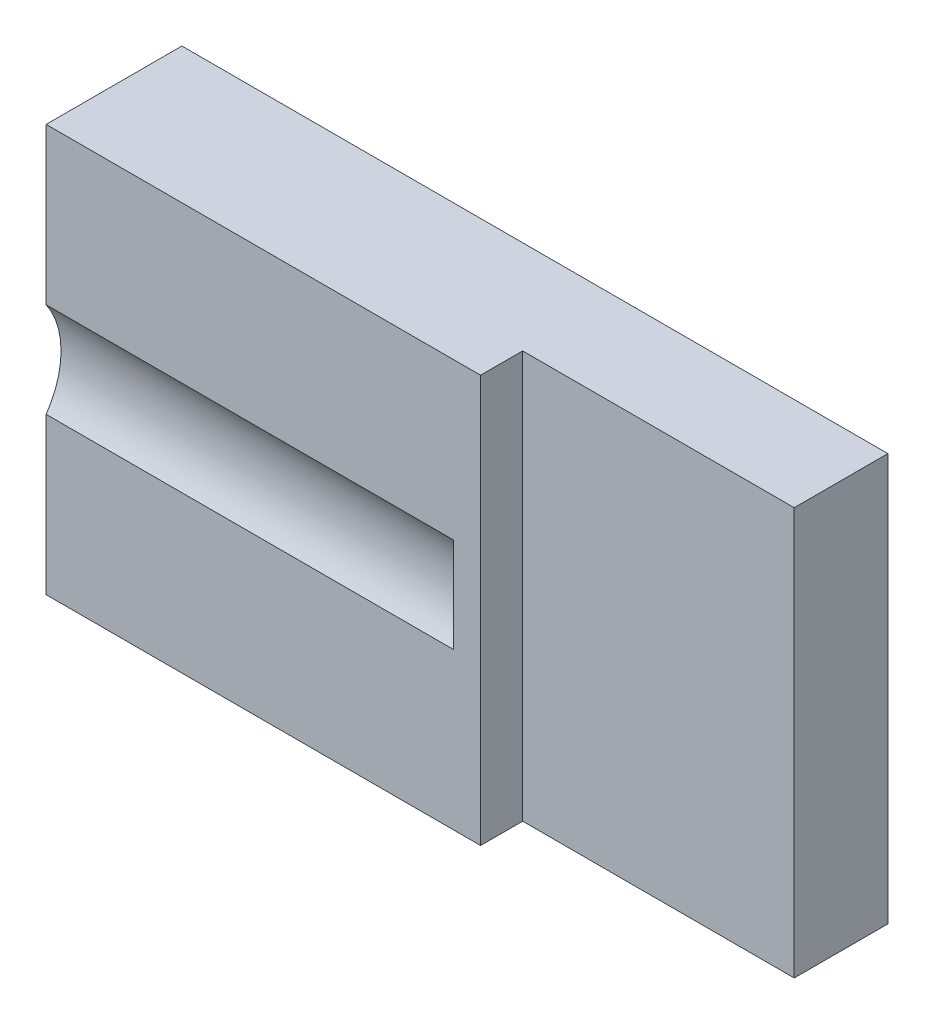
ISO-10303-21;
HEADER;
FILE_DESCRIPTION(('STEP AP214'),'2;1');
FILE_NAME('part.step','',(''),(''),'','','');
FILE_SCHEMA(('AUTOMOTIVE_DESIGN { 1 0 10303 214 1 1 1 1 }'));
ENDSEC;
DATA;
#1=APPLICATION_CONTEXT('core data for automotive mechanical design processes');
#2=APPLICATION_PROTOCOL_DEFINITION('international standard','automotive_design',2000,#1);
#3=PRODUCT_CONTEXT('',#1,'mechanical');
#4=PRODUCT('Part','Part','',(#3));
#5=PRODUCT_RELATED_PRODUCT_CATEGORY('part','',(#4));
#6=PRODUCT_DEFINITION_FORMATION('','',#4);
#7=PRODUCT_DEFINITION_CONTEXT('part definition',#1,'design');
#8=PRODUCT_DEFINITION('design','',#6,#7);
#9=PRODUCT_DEFINITION_SHAPE('','',#8);
#10=(LENGTH_UNIT() NAMED_UNIT(*) SI_UNIT(.MILLI.,.METRE.));
#11=(NAMED_UNIT(*) PLANE_ANGLE_UNIT() SI_UNIT($,.RADIAN.));
#12=(NAMED_UNIT(*) SI_UNIT($,.STERADIAN.) SOLID_ANGLE_UNIT());
#13=UNCERTAINTY_MEASURE_WITH_UNIT(LENGTH_MEASURE(1.E-05),#10,'distance_accuracy_value','');
#14=(GEOMETRIC_REPRESENTATION_CONTEXT(3) GLOBAL_UNCERTAINTY_ASSIGNED_CONTEXT((#13)) GLOBAL_UNIT_ASSIGNED_CONTEXT((#10,
#11,#12)) REPRESENTATION_CONTEXT('',''));
#15=CARTESIAN_POINT('',(0.,0.,0.));
#16=DIRECTION('',(0.,0.,1.));
#17=DIRECTION('',(1.,0.,0.));
#18=AXIS2_PLACEMENT_3D('',#15,#16,#17);
#19=CARTESIAN_POINT('',(0.,0.,5.));
#20=DIRECTION('',(1.,0.,0.));
#21=DIRECTION('',(0.,0.,-1.));
#22=AXIS2_PLACEMENT_3D('',#19,#20,#21);
#23=PLANE('',#22);
#24=DIRECTION('',(0.,-1.,0.));
#25=VECTOR('',#24,1.);
#26=CARTESIAN_POINT('',(0.,0.,5.));
#27=LINE('',#26,#25);
#28=CARTESIAN_POINT('',(0.,5.75285947903439,5.));
#29=VERTEX_POINT('',#28);
#30=CARTESIAN_POINT('',(0.,0.,5.));
#31=VERTEX_POINT('',#30);
#32=EDGE_CURVE('E129',#29,#31,#27,.T.);
#33=ORIENTED_EDGE('',*,*,#32,.F.);
#34=CARTESIAN_POINT('',(0.,7.5,7.5));
#35=DIRECTION('',(-1.,0.,0.));
#36=DIRECTION('',(0.,0.,-1.));
#37=AXIS2_PLACEMENT_3D('',#34,#35,#36);
#38=CIRCLE('',#37,3.05);
#39=CARTESIAN_POINT('',(0.,9.24714052096562,5.));
#40=VERTEX_POINT('',#39);
#41=EDGE_CURVE('E150',#40,#29,#38,.T.);
#42=ORIENTED_EDGE('',*,*,#41,.F.);
#43=CARTESIAN_POINT('',(0.,15.,5.));
#44=VERTEX_POINT('',#43);
#45=EDGE_CURVE('E142',#44,#40,#27,.T.);
#46=ORIENTED_EDGE('',*,*,#45,.F.);
#47=DIRECTION('',(0.,0.,-1.));
#48=VECTOR('',#47,1.);
#49=CARTESIAN_POINT('',(0.,15.,5.));
#50=LINE('',#49,#48);
#51=CARTESIAN_POINT('',(0.,15.,0.));
#52=VERTEX_POINT('',#51);
#53=EDGE_CURVE('E121',#44,#52,#50,.T.);
#54=ORIENTED_EDGE('',*,*,#53,.T.);
#55=DIRECTION('',(0.,-1.,0.));
#56=VECTOR('',#55,1.);
#57=CARTESIAN_POINT('',(0.,0.,0.));
#58=LINE('',#57,#56);
#59=CARTESIAN_POINT('',(0.,0.,0.));
#60=VERTEX_POINT('',#59);
#61=EDGE_CURVE('E134',#52,#60,#58,.T.);
#62=ORIENTED_EDGE('',*,*,#61,.T.);
#63=DIRECTION('',(0.,0.,-1.));
#64=VECTOR('',#63,1.);
#65=CARTESIAN_POINT('',(0.,0.,5.));
#66=LINE('',#65,#64);
#67=EDGE_CURVE('E11',#31,#60,#66,.T.);
#68=ORIENTED_EDGE('',*,*,#67,.F.);
#69=EDGE_LOOP('',(#33,#42,#46,#54,#62,#68));
#70=FACE_BOUND('',#69,.T.);
#71=ADVANCED_FACE('F34',(#70),#23,.F.);
#72=CARTESIAN_POINT('',(0.,0.,5.));
#73=DIRECTION('',(0.,1.,0.));
#74=DIRECTION('',(0.,0.,1.));
#75=AXIS2_PLACEMENT_3D('',#72,#73,#74);
#76=PLANE('',#75);
#77=DIRECTION('',(1.,0.,0.));
#78=VECTOR('',#77,1.);
#79=CARTESIAN_POINT('',(26.,0.,3.45));
#80=LINE('',#79,#78);
#81=CARTESIAN_POINT('',(16.,0.,3.45));
#82=VERTEX_POINT('',#81);
#83=CARTESIAN_POINT('',(26.,0.,3.45));
#84=VERTEX_POINT('',#83);
#85=EDGE_CURVE('E104',#82,#84,#80,.T.);
#86=ORIENTED_EDGE('',*,*,#85,.F.);
#87=DIRECTION('',(0.,0.,1.));
#88=VECTOR('',#87,1.);
#89=CARTESIAN_POINT('',(16.,0.,3.45));
#90=LINE('',#89,#88);
#91=CARTESIAN_POINT('',(16.,0.,5.));
#92=VERTEX_POINT('',#91);
#93=EDGE_CURVE('E152',#82,#92,#90,.T.);
#94=ORIENTED_EDGE('',*,*,#93,.T.);
#95=DIRECTION('',(1.,0.,0.));
#96=VECTOR('',#95,1.);
#97=CARTESIAN_POINT('',(0.,0.,5.));
#98=LINE('',#97,#96);
#99=EDGE_CURVE('E139',#31,#92,#98,.T.);
#100=ORIENTED_EDGE('',*,*,#99,.F.);
#101=ORIENTED_EDGE('',*,*,#67,.T.);
#102=DIRECTION('',(1.,0.,0.));
#103=VECTOR('',#102,1.);
#104=CARTESIAN_POINT('',(0.,0.,0.));
#105=LINE('',#104,#103);
#106=CARTESIAN_POINT('',(26.,0.,0.));
#107=VERTEX_POINT('',#106);
#108=EDGE_CURVE('E131',#60,#107,#105,.T.);
#109=ORIENTED_EDGE('',*,*,#108,.T.);
#110=DIRECTION('',(0.,0.,-1.));
#111=VECTOR('',#110,1.);
#112=CARTESIAN_POINT('',(26.,0.,5.));
#113=LINE('',#112,#111);
#114=EDGE_CURVE('E41',#84,#107,#113,.T.);
#115=ORIENTED_EDGE('',*,*,#114,.F.);
#116=EDGE_LOOP('',(#86,#94,#100,#101,#109,#115));
#117=FACE_BOUND('',#116,.T.);
#118=ADVANCED_FACE('F161',(#117),#76,.F.);
#119=CARTESIAN_POINT('',(26.,0.,5.));
#120=DIRECTION('',(-1.,0.,0.));
#121=DIRECTION('',(0.,0.,1.));
#122=AXIS2_PLACEMENT_3D('',#119,#120,#121);
#123=PLANE('',#122);
#124=DIRECTION('',(0.,0.,-1.));
#125=VECTOR('',#124,1.);
#126=CARTESIAN_POINT('',(26.,15.,5.));
#127=LINE('',#126,#125);
#128=CARTESIAN_POINT('',(26.,15.,3.45));
#129=VERTEX_POINT('',#128);
#130=CARTESIAN_POINT('',(26.,15.,0.));
#131=VERTEX_POINT('',#130);
#132=EDGE_CURVE('E113',#129,#131,#127,.T.);
#133=ORIENTED_EDGE('',*,*,#132,.F.);
#134=DIRECTION('',(0.,1.,0.));
#135=VECTOR('',#134,1.);
#136=CARTESIAN_POINT('',(26.,15.,3.45));
#137=LINE('',#136,#135);
#138=EDGE_CURVE('E98',#84,#129,#137,.T.);
#139=ORIENTED_EDGE('',*,*,#138,.F.);
#140=ORIENTED_EDGE('',*,*,#114,.T.);
#141=DIRECTION('',(0.,1.,0.));
#142=VECTOR('',#141,1.);
#143=CARTESIAN_POINT('',(26.,0.,0.));
#144=LINE('',#143,#142);
#145=EDGE_CURVE('E119',#107,#131,#144,.T.);
#146=ORIENTED_EDGE('',*,*,#145,.T.);
#147=EDGE_LOOP('',(#133,#139,#140,#146));
#148=FACE_BOUND('',#147,.T.);
#149=ADVANCED_FACE('F117',(#148),#123,.F.);
#150=CARTESIAN_POINT('',(0.,15.,5.));
#151=DIRECTION('',(0.,-1.,0.));
#152=DIRECTION('',(0.,0.,-1.));
#153=AXIS2_PLACEMENT_3D('',#150,#151,#152);
#154=PLANE('',#153);
#155=DIRECTION('',(-1.,0.,0.));
#156=VECTOR('',#155,1.);
#157=CARTESIAN_POINT('',(0.,15.,5.));
#158=LINE('',#157,#156);
#159=CARTESIAN_POINT('',(16.,15.,5.));
#160=VERTEX_POINT('',#159);
#161=EDGE_CURVE('E124',#160,#44,#158,.T.);
#162=ORIENTED_EDGE('',*,*,#161,.F.);
#163=DIRECTION('',(0.,0.,1.));
#164=VECTOR('',#163,1.);
#165=CARTESIAN_POINT('',(16.,15.,3.45));
#166=LINE('',#165,#164);
#167=CARTESIAN_POINT('',(16.,15.,3.45));
#168=VERTEX_POINT('',#167);
#169=EDGE_CURVE('E48',#168,#160,#166,.T.);
#170=ORIENTED_EDGE('',*,*,#169,.F.);
#171=DIRECTION('',(-1.,0.,0.));
#172=VECTOR('',#171,1.);
#173=CARTESIAN_POINT('',(26.,15.,3.45));
#174=LINE('',#173,#172);
#175=EDGE_CURVE('E102',#129,#168,#174,.T.);
#176=ORIENTED_EDGE('',*,*,#175,.F.);
#177=ORIENTED_EDGE('',*,*,#132,.T.);
#178=DIRECTION('',(-1.,0.,0.));
#179=VECTOR('',#178,1.);
#180=CARTESIAN_POINT('',(0.,15.,0.));
#181=LINE('',#180,#179);
#182=EDGE_CURVE('E127',#131,#52,#181,.T.);
#183=ORIENTED_EDGE('',*,*,#182,.T.);
#184=ORIENTED_EDGE('',*,*,#53,.F.);
#185=EDGE_LOOP('',(#162,#170,#176,#177,#183,#184));
#186=FACE_BOUND('',#185,.T.);
#187=ADVANCED_FACE('F112',(#186),#154,.F.);
#188=CARTESIAN_POINT('',(0.,0.,5.));
#189=DIRECTION('',(0.,0.,-1.));
#190=DIRECTION('',(-1.,0.,0.));
#191=AXIS2_PLACEMENT_3D('',#188,#189,#190);
#192=PLANE('',#191);
#193=ORIENTED_EDGE('',*,*,#99,.T.);
#194=DIRECTION('',(0.,-1.,0.));
#195=VECTOR('',#194,1.);
#196=CARTESIAN_POINT('',(16.,15.,5.));
#197=LINE('',#196,#195);
#198=EDGE_CURVE('E108',#160,#92,#197,.T.);
#199=ORIENTED_EDGE('',*,*,#198,.F.);
#200=ORIENTED_EDGE('',*,*,#161,.T.);
#201=ORIENTED_EDGE('',*,*,#45,.T.);
#202=DIRECTION('',(-1.,0.,0.));
#203=VECTOR('',#202,1.);
#204=CARTESIAN_POINT('',(15.,9.24714052096562,5.));
#205=LINE('',#204,#203);
#206=CARTESIAN_POINT('',(15.,9.24714052096562,5.));
#207=VERTEX_POINT('',#206);
#208=EDGE_CURVE('E137',#207,#40,#205,.T.);
#209=ORIENTED_EDGE('',*,*,#208,.F.);
#210=DIRECTION('',(0.,1.,0.));
#211=VECTOR('',#210,1.);
#212=CARTESIAN_POINT('',(15.,9.24714052096562,5.));
#213=LINE('',#212,#211);
#214=CARTESIAN_POINT('',(15.,5.75285947903439,5.));
#215=VERTEX_POINT('',#214);
#216=EDGE_CURVE('E148',#215,#207,#213,.T.);
#217=ORIENTED_EDGE('',*,*,#216,.F.);
#218=DIRECTION('',(-1.,0.,0.));
#219=VECTOR('',#218,1.);
#220=CARTESIAN_POINT('',(15.,5.75285947903439,5.));
#221=LINE('',#220,#219);
#222=EDGE_CURVE('E145',#215,#29,#221,.T.);
#223=ORIENTED_EDGE('',*,*,#222,.T.);
#224=ORIENTED_EDGE('',*,*,#32,.T.);
#225=EDGE_LOOP('',(#193,#199,#200,#201,#209,#217,#223,#224));
#226=FACE_BOUND('',#225,.T.);
#227=ADVANCED_FACE('F174',(#226),#192,.F.);
#228=CARTESIAN_POINT('',(0.,0.,0.));
#229=DIRECTION('',(0.,0.,-1.));
#230=DIRECTION('',(-1.,0.,0.));
#231=AXIS2_PLACEMENT_3D('',#228,#229,#230);
#232=PLANE('',#231);
#233=ORIENTED_EDGE('',*,*,#61,.F.);
#234=ORIENTED_EDGE('',*,*,#182,.F.);
#235=ORIENTED_EDGE('',*,*,#145,.F.);
#236=ORIENTED_EDGE('',*,*,#108,.F.);
#237=EDGE_LOOP('',(#233,#234,#235,#236));
#238=FACE_BOUND('',#237,.T.);
#239=ADVANCED_FACE('F166',(#238),#232,.T.);
#240=CARTESIAN_POINT('',(15.,7.5,7.5));
#241=DIRECTION('',(-1.,0.,0.));
#242=DIRECTION('',(0.,0.,1.));
#243=AXIS2_PLACEMENT_3D('',#240,#241,#242);
#244=CYLINDRICAL_SURFACE('',#243,3.05);
#245=ORIENTED_EDGE('',*,*,#41,.T.);
#246=ORIENTED_EDGE('',*,*,#222,.F.);
#247=CARTESIAN_POINT('',(15.,7.5,7.5));
#248=DIRECTION('',(-1.,0.,0.));
#249=DIRECTION('',(0.,0.,-1.));
#250=AXIS2_PLACEMENT_3D('',#247,#248,#249);
#251=CIRCLE('',#250,3.05);
#252=EDGE_CURVE('E55',#207,#215,#251,.T.);
#253=ORIENTED_EDGE('',*,*,#252,.F.);
#254=ORIENTED_EDGE('',*,*,#208,.T.);
#255=EDGE_LOOP('',(#245,#246,#253,#254));
#256=FACE_BOUND('',#255,.T.);
#257=ADVANCED_FACE('F185',(#256),#244,.F.);
#258=CARTESIAN_POINT('',(15.,7.5,7.5));
#259=DIRECTION('',(1.,0.,0.));
#260=DIRECTION('',(0.,0.,-1.));
#261=AXIS2_PLACEMENT_3D('',#258,#259,#260);
#262=PLANE('',#261);
#263=ORIENTED_EDGE('',*,*,#252,.T.);
#264=ORIENTED_EDGE('',*,*,#216,.T.);
#265=EDGE_LOOP('',(#263,#264));
#266=FACE_BOUND('',#265,.T.);
#267=ADVANCED_FACE('F178',(#266),#262,.F.);
#268=CARTESIAN_POINT('',(16.,15.,3.45));
#269=DIRECTION('',(-1.,0.,0.));
#270=DIRECTION('',(0.,-1.,0.));
#271=AXIS2_PLACEMENT_3D('',#268,#269,#270);
#272=PLANE('',#271);
#273=ORIENTED_EDGE('',*,*,#198,.T.);
#274=ORIENTED_EDGE('',*,*,#93,.F.);
#275=DIRECTION('',(0.,-1.,0.));
#276=VECTOR('',#275,1.);
#277=CARTESIAN_POINT('',(16.,15.,3.45));
#278=LINE('',#277,#276);
#279=EDGE_CURVE('E115',#168,#82,#278,.T.);
#280=ORIENTED_EDGE('',*,*,#279,.F.);
#281=ORIENTED_EDGE('',*,*,#169,.T.);
#282=EDGE_LOOP('',(#273,#274,#280,#281));
#283=FACE_BOUND('',#282,.T.);
#284=ADVANCED_FACE('F176',(#283),#272,.F.);
#285=CARTESIAN_POINT('',(0.,0.,3.45));
#286=DIRECTION('',(0.,0.,-1.));
#287=DIRECTION('',(-1.,0.,0.));
#288=AXIS2_PLACEMENT_3D('',#285,#286,#287);
#289=PLANE('',#288);
#290=ORIENTED_EDGE('',*,*,#138,.T.);
#291=ORIENTED_EDGE('',*,*,#175,.T.);
#292=ORIENTED_EDGE('',*,*,#279,.T.);
#293=ORIENTED_EDGE('',*,*,#85,.T.);
#294=EDGE_LOOP('',(#290,#291,#292,#293));
#295=FACE_BOUND('',#294,.T.);
#296=ADVANCED_FACE('F100',(#295),#289,.F.);
#297=CLOSED_SHELL('',(#71,#118,#149,#187,#227,#239,#257,#267,#284,#296));
#298=MANIFOLD_SOLID_BREP('B2',#297);
#299=ADVANCED_BREP_SHAPE_REPRESENTATION('',(#18,#298),#14);
#300=SHAPE_DEFINITION_REPRESENTATION(#9,#299);
ENDSEC;
END-ISO-10303-21;
